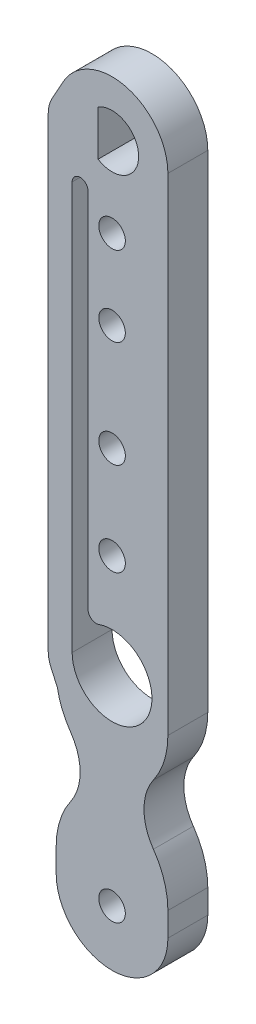
ISO-10303-21;
HEADER;
FILE_DESCRIPTION(('STEP AP214'),'2;1');
FILE_NAME('part.step','',(''),(''),'','','');
FILE_SCHEMA(('AUTOMOTIVE_DESIGN { 1 0 10303 214 1 1 1 1 }'));
ENDSEC;
DATA;
#1=APPLICATION_CONTEXT('core data for automotive mechanical design processes');
#2=APPLICATION_PROTOCOL_DEFINITION('international standard','automotive_design',2000,#1);
#3=PRODUCT_CONTEXT('',#1,'mechanical');
#4=PRODUCT('Part','Part','',(#3));
#5=PRODUCT_RELATED_PRODUCT_CATEGORY('part','',(#4));
#6=PRODUCT_DEFINITION_FORMATION('','',#4);
#7=PRODUCT_DEFINITION_CONTEXT('part definition',#1,'design');
#8=PRODUCT_DEFINITION('design','',#6,#7);
#9=PRODUCT_DEFINITION_SHAPE('','',#8);
#10=(LENGTH_UNIT() NAMED_UNIT(*) SI_UNIT(.MILLI.,.METRE.));
#11=(NAMED_UNIT(*) PLANE_ANGLE_UNIT() SI_UNIT($,.RADIAN.));
#12=(NAMED_UNIT(*) SI_UNIT($,.STERADIAN.) SOLID_ANGLE_UNIT());
#13=UNCERTAINTY_MEASURE_WITH_UNIT(LENGTH_MEASURE(1.E-05),#10,'distance_accuracy_value','');
#14=(GEOMETRIC_REPRESENTATION_CONTEXT(3) GLOBAL_UNCERTAINTY_ASSIGNED_CONTEXT((#13)) GLOBAL_UNIT_ASSIGNED_CONTEXT((#10,
#11,#12)) REPRESENTATION_CONTEXT('',''));
#15=CARTESIAN_POINT('',(0.,0.,0.));
#16=DIRECTION('',(0.,0.,1.));
#17=DIRECTION('',(1.,0.,0.));
#18=AXIS2_PLACEMENT_3D('',#15,#16,#17);
#19=CARTESIAN_POINT('',(-340.183039587022,54.0177257171476,3.));
#20=DIRECTION('',(0.,0.,1.));
#21=DIRECTION('',(1.,0.,0.));
#22=AXIS2_PLACEMENT_3D('',#19,#20,#21);
#23=PLANE('',#22);
#24=CARTESIAN_POINT('',(-338.383039587022,63.6177257171478,3.));
#25=DIRECTION('',(0.,0.,1.));
#26=DIRECTION('',(1.,0.,0.));
#27=AXIS2_PLACEMENT_3D('',#24,#25,#26);
#28=CIRCLE('',#27,1.);
#29=CARTESIAN_POINT('',(-337.383039587022,63.6177257171478,3.));
#30=VERTEX_POINT('',#29);
#31=EDGE_CURVE('E721',#30,#30,#28,.T.);
#32=ORIENTED_EDGE('',*,*,#31,.F.);
#33=EDGE_LOOP('',(#32));
#34=FACE_BOUND('',#33,.T.);
#35=CARTESIAN_POINT('',(-338.383039587022,78.6177257171478,3.));
#36=DIRECTION('',(0.,0.,1.));
#37=DIRECTION('',(1.,0.,0.));
#38=AXIS2_PLACEMENT_3D('',#35,#36,#37);
#39=CIRCLE('',#38,0.999999999999998);
#40=CARTESIAN_POINT('',(-337.383039587022,78.6177257171478,3.));
#41=VERTEX_POINT('',#40);
#42=EDGE_CURVE('E207',#41,#41,#39,.T.);
#43=ORIENTED_EDGE('',*,*,#42,.F.);
#44=EDGE_LOOP('',(#43));
#45=FACE_BOUND('',#44,.T.);
#46=CARTESIAN_POINT('',(-340.183039587022,54.0177257171476,3.));
#47=DIRECTION('',(0.,0.,1.));
#48=DIRECTION('',(1.,0.,0.));
#49=AXIS2_PLACEMENT_3D('',#46,#47,#48);
#50=CIRCLE('',#49,6.);
#51=CARTESIAN_POINT('',(-335.27120079609,50.5718818884324,3.));
#52=VERTEX_POINT('',#51);
#53=CARTESIAN_POINT('',(-334.183039587022,54.0177257171476,3.));
#54=VERTEX_POINT('',#53);
#55=EDGE_CURVE('E255',#52,#54,#50,.T.);
#56=ORIENTED_EDGE('',*,*,#55,.T.);
#57=DIRECTION('',(0.,1.,0.));
#58=VECTOR('',#57,1.);
#59=CARTESIAN_POINT('',(-334.183039587022,54.0177257171476,3.));
#60=LINE('',#59,#58);
#61=CARTESIAN_POINT('',(-334.183039587022,90.6177257171478,3.));
#62=VERTEX_POINT('',#61);
#63=EDGE_CURVE('E258',#54,#62,#60,.T.);
#64=ORIENTED_EDGE('',*,*,#63,.T.);
#65=CARTESIAN_POINT('',(-338.383039587022,90.6177257171478,3.));
#66=DIRECTION('',(0.,0.,1.));
#67=DIRECTION('',(1.,0.,0.));
#68=AXIS2_PLACEMENT_3D('',#65,#66,#67);
#69=CIRCLE('',#68,4.20000000000002);
#70=CARTESIAN_POINT('',(-342.088358547563,92.595252303734,3.));
#71=VERTEX_POINT('',#70);
#72=EDGE_CURVE('E261',#62,#71,#69,.T.);
#73=ORIENTED_EDGE('',*,*,#72,.T.);
#74=DIRECTION('',(-0.484308711135793,-0.874897178140373,0.));
#75=VECTOR('',#74,1.);
#76=CARTESIAN_POINT('',(-342.088358547563,92.595252303734,3.));
#77=LINE('',#76,#75);
#78=CARTESIAN_POINT('',(-342.882792814559,91.160117476647,3.));
#79=VERTEX_POINT('',#78);
#80=EDGE_CURVE('E263',#71,#79,#77,.T.);
#81=ORIENTED_EDGE('',*,*,#80,.T.);
#82=CARTESIAN_POINT('',(-340.783039587022,89.9977765699208,3.));
#83=DIRECTION('',(0.,0.,1.));
#84=DIRECTION('',(1.,0.,0.));
#85=AXIS2_PLACEMENT_3D('',#82,#83,#84);
#86=CIRCLE('',#85,2.40000000000001);
#87=CARTESIAN_POINT('',(-343.183039587022,89.9977765699209,3.));
#88=VERTEX_POINT('',#87);
#89=EDGE_CURVE('E265',#79,#88,#86,.T.);
#90=ORIENTED_EDGE('',*,*,#89,.T.);
#91=DIRECTION('',(0.,-1.,0.));
#92=VECTOR('',#91,1.);
#93=CARTESIAN_POINT('',(-343.183039587022,89.9977765699209,3.));
#94=LINE('',#93,#92);
#95=CARTESIAN_POINT('',(-343.183039587022,55.020224039338,3.));
#96=VERTEX_POINT('',#95);
#97=EDGE_CURVE('E267',#88,#96,#94,.T.);
#98=ORIENTED_EDGE('',*,*,#97,.T.);
#99=CARTESIAN_POINT('',(-340.783039587022,55.0202240393379,3.));
#100=DIRECTION('',(0.,0.,1.));
#101=DIRECTION('',(1.,0.,0.));
#102=AXIS2_PLACEMENT_3D('',#99,#100,#101);
#103=CIRCLE('',#102,2.40000000000006);
#104=CARTESIAN_POINT('',(-342.964857766499,54.0203893371468,3.));
#105=VERTEX_POINT('',#104);
#106=EDGE_CURVE('E269',#96,#105,#103,.T.);
#107=ORIENTED_EDGE('',*,*,#106,.T.);
#108=DIRECTION('',(0.416597792579682,-0.909090908115209,0.));
#109=VECTOR('',#108,1.);
#110=CARTESIAN_POINT('',(-342.964857766499,54.0203893371468,3.));
#111=LINE('',#110,#109);
#112=CARTESIAN_POINT('',(-342.495395341089,52.995938343303,3.));
#113=VERTEX_POINT('',#112);
#114=EDGE_CURVE('E271',#105,#113,#111,.T.);
#115=ORIENTED_EDGE('',*,*,#114,.T.);
#116=CARTESIAN_POINT('',(-336.583039587022,54.0177257171475,3.));
#117=DIRECTION('',(0.,0.,1.));
#118=DIRECTION('',(1.,0.,0.));
#119=AXIS2_PLACEMENT_3D('',#116,#117,#118);
#120=CIRCLE('',#119,5.99999999999999);
#121=CARTESIAN_POINT('',(-341.494878377954,50.5718818884324,3.));
#122=VERTEX_POINT('',#121);
#123=EDGE_CURVE('E273',#113,#122,#120,.T.);
#124=ORIENTED_EDGE('',*,*,#123,.T.);
#125=CARTESIAN_POINT('',(-344.708039587022,48.3177257171477,3.));
#126=DIRECTION('',(0.,0.,-1.));
#127=DIRECTION('',(1.,0.,0.));
#128=AXIS2_PLACEMENT_3D('',#125,#126,#127);
#129=CIRCLE('',#128,3.92499999999998);
#130=CARTESIAN_POINT('',(-341.494878377954,46.0635695458632,3.));
#131=VERTEX_POINT('',#130);
#132=EDGE_CURVE('E275',#122,#131,#129,.T.);
#133=ORIENTED_EDGE('',*,*,#132,.T.);
#134=CARTESIAN_POINT('',(-336.583039587022,42.6177257171478,3.));
#135=DIRECTION('',(0.,0.,1.));
#136=DIRECTION('',(1.,0.,0.));
#137=AXIS2_PLACEMENT_3D('',#134,#135,#136);
#138=CIRCLE('',#137,6.);
#139=CARTESIAN_POINT('',(-342.583039587022,42.6177257171478,3.));
#140=VERTEX_POINT('',#139);
#141=EDGE_CURVE('E277',#131,#140,#138,.T.);
#142=ORIENTED_EDGE('',*,*,#141,.T.);
#143=DIRECTION('',(0.,-1.,0.));
#144=VECTOR('',#143,1.);
#145=CARTESIAN_POINT('',(-342.583039587022,42.6177257171478,3.));
#146=LINE('',#145,#144);
#147=CARTESIAN_POINT('',(-342.583039587022,40.8177257171477,3.));
#148=VERTEX_POINT('',#147);
#149=EDGE_CURVE('E279',#140,#148,#146,.T.);
#150=ORIENTED_EDGE('',*,*,#149,.T.);
#151=CARTESIAN_POINT('',(-338.383039587022,40.8177257171477,3.));
#152=DIRECTION('',(0.,0.,1.));
#153=DIRECTION('',(1.,0.,0.));
#154=AXIS2_PLACEMENT_3D('',#151,#152,#153);
#155=CIRCLE('',#154,4.19999999999998);
#156=CARTESIAN_POINT('',(-334.183039587022,40.8177257171477,3.));
#157=VERTEX_POINT('',#156);
#158=EDGE_CURVE('E281',#148,#157,#155,.T.);
#159=ORIENTED_EDGE('',*,*,#158,.T.);
#160=DIRECTION('',(0.,1.,0.));
#161=VECTOR('',#160,1.);
#162=CARTESIAN_POINT('',(-334.183039587022,40.8177257171477,3.));
#163=LINE('',#162,#161);
#164=CARTESIAN_POINT('',(-334.183039587022,42.6177257171478,3.));
#165=VERTEX_POINT('',#164);
#166=EDGE_CURVE('E283',#157,#165,#163,.T.);
#167=ORIENTED_EDGE('',*,*,#166,.T.);
#168=CARTESIAN_POINT('',(-340.183039587022,42.6177257171478,3.));
#169=DIRECTION('',(0.,0.,1.));
#170=DIRECTION('',(1.,0.,0.));
#171=AXIS2_PLACEMENT_3D('',#168,#169,#170);
#172=CIRCLE('',#171,5.99999999999998);
#173=CARTESIAN_POINT('',(-335.27120079609,46.0635695458631,3.));
#174=VERTEX_POINT('',#173);
#175=EDGE_CURVE('E285',#165,#174,#172,.T.);
#176=ORIENTED_EDGE('',*,*,#175,.T.);
#177=CARTESIAN_POINT('',(-332.058039587022,48.3177257171477,3.));
#178=DIRECTION('',(0.,0.,-1.));
#179=DIRECTION('',(1.,0.,0.));
#180=AXIS2_PLACEMENT_3D('',#177,#178,#179);
#181=CIRCLE('',#180,3.92499999999998);
#182=EDGE_CURVE('E287',#174,#52,#181,.T.);
#183=ORIENTED_EDGE('',*,*,#182,.T.);
#184=EDGE_LOOP('',(#56,#64,#73,#81,#90,#98,#107,#115,#124,#133,#142,#150,#159,#167,#176,#183));
#185=FACE_BOUND('',#184,.T.);
#186=CARTESIAN_POINT('',(-338.383039587022,84.6177257171478,3.));
#187=DIRECTION('',(0.,0.,1.));
#188=DIRECTION('',(1.,0.,0.));
#189=AXIS2_PLACEMENT_3D('',#186,#187,#188);
#190=CIRCLE('',#189,0.999999999999998);
#191=CARTESIAN_POINT('',(-337.383039587022,84.6177257171478,3.));
#192=VERTEX_POINT('',#191);
#193=EDGE_CURVE('E249',#192,#192,#190,.T.);
#194=ORIENTED_EDGE('',*,*,#193,.F.);
#195=EDGE_LOOP('',(#194));
#196=FACE_BOUND('',#195,.T.);
#197=DIRECTION('',(0.,1.,0.));
#198=VECTOR('',#197,1.);
#199=CARTESIAN_POINT('',(-340.183039587022,59.2118382668432,3.));
#200=LINE('',#199,#198);
#201=CARTESIAN_POINT('',(-340.183039587022,59.2118382668432,3.));
#202=VERTEX_POINT('',#201);
#203=CARTESIAN_POINT('',(-340.183039587022,86.4608037789825,3.));
#204=VERTEX_POINT('',#203);
#205=EDGE_CURVE('E213',#202,#204,#200,.T.);
#206=ORIENTED_EDGE('',*,*,#205,.F.);
#207=CARTESIAN_POINT('',(-339.583039587022,59.2118382668432,3.));
#208=DIRECTION('',(0.,0.,-1.));
#209=DIRECTION('',(1.,0.,0.));
#210=AXIS2_PLACEMENT_3D('',#207,#208,#209);
#211=CIRCLE('',#210,0.600000000000008);
#212=CARTESIAN_POINT('',(-339.383039587022,58.6461528418939,3.));
#213=VERTEX_POINT('',#212);
#214=EDGE_CURVE('E211',#213,#202,#211,.T.);
#215=ORIENTED_EDGE('',*,*,#214,.F.);
#216=CARTESIAN_POINT('',(-338.383039587022,55.8177257171477,3.));
#217=DIRECTION('',(0.,0.,1.));
#218=DIRECTION('',(1.,0.,0.));
#219=AXIS2_PLACEMENT_3D('',#216,#217,#218);
#220=CIRCLE('',#219,3.);
#221=CARTESIAN_POINT('',(-341.383039587022,55.8177257171477,3.));
#222=VERTEX_POINT('',#221);
#223=EDGE_CURVE('E221',#222,#213,#220,.T.);
#224=ORIENTED_EDGE('',*,*,#223,.F.);
#225=DIRECTION('',(0.,-1.,0.));
#226=VECTOR('',#225,1.);
#227=CARTESIAN_POINT('',(-341.383039587022,86.4608037789825,3.));
#228=LINE('',#227,#226);
#229=CARTESIAN_POINT('',(-341.383039587022,86.4608037789825,3.));
#230=VERTEX_POINT('',#229);
#231=EDGE_CURVE('E218',#230,#222,#228,.T.);
#232=ORIENTED_EDGE('',*,*,#231,.F.);
#233=CARTESIAN_POINT('',(-340.783039587022,86.4608037789825,3.));
#234=DIRECTION('',(0.,0.,1.));
#235=DIRECTION('',(1.,0.,0.));
#236=AXIS2_PLACEMENT_3D('',#233,#234,#235);
#237=CIRCLE('',#236,0.600000000000017);
#238=EDGE_CURVE('E216',#204,#230,#237,.T.);
#239=ORIENTED_EDGE('',*,*,#238,.F.);
#240=EDGE_LOOP('',(#206,#215,#224,#232,#239));
#241=FACE_BOUND('',#240,.T.);
#242=DIRECTION('',(0.,-1.,0.));
#243=VECTOR('',#242,1.);
#244=CARTESIAN_POINT('',(-339.433039587022,90.6177257171478,3.));
#245=LINE('',#244,#243);
#246=CARTESIAN_POINT('',(-339.433039587022,92.3199301702026,3.));
#247=VERTEX_POINT('',#246);
#248=CARTESIAN_POINT('',(-339.433039587022,88.915521264093,3.));
#249=VERTEX_POINT('',#248);
#250=EDGE_CURVE('E189',#247,#249,#245,.T.);
#251=ORIENTED_EDGE('',*,*,#250,.F.);
#252=CARTESIAN_POINT('',(-338.383039587022,90.6177257171478,3.));
#253=DIRECTION('',(0.,0.,1.));
#254=DIRECTION('',(1.,0.,0.));
#255=AXIS2_PLACEMENT_3D('',#252,#253,#254);
#256=CIRCLE('',#255,1.99999999999998);
#257=EDGE_CURVE('E195',#249,#247,#256,.T.);
#258=ORIENTED_EDGE('',*,*,#257,.F.);
#259=EDGE_LOOP('',(#251,#258));
#260=FACE_BOUND('',#259,.T.);
#261=CARTESIAN_POINT('',(-338.383039587022,40.8177257171477,3.));
#262=DIRECTION('',(0.,0.,1.));
#263=DIRECTION('',(1.,0.,0.));
#264=AXIS2_PLACEMENT_3D('',#261,#262,#263);
#265=CIRCLE('',#264,0.999999999999998);
#266=CARTESIAN_POINT('',(-337.383039587022,40.8177257171477,3.));
#267=VERTEX_POINT('',#266);
#268=EDGE_CURVE('E727',#267,#267,#265,.T.);
#269=ORIENTED_EDGE('',*,*,#268,.F.);
#270=EDGE_LOOP('',(#269));
#271=FACE_BOUND('',#270,.T.);
#272=CARTESIAN_POINT('',(-338.383039587022,70.6177257171478,3.));
#273=DIRECTION('',(0.,0.,1.));
#274=DIRECTION('',(1.,0.,0.));
#275=AXIS2_PLACEMENT_3D('',#272,#273,#274);
#276=CIRCLE('',#275,1.);
#277=CARTESIAN_POINT('',(-337.383039587022,70.6177257171478,3.));
#278=VERTEX_POINT('',#277);
#279=EDGE_CURVE('E712',#278,#278,#276,.T.);
#280=ORIENTED_EDGE('',*,*,#279,.F.);
#281=EDGE_LOOP('',(#280));
#282=FACE_BOUND('',#281,.T.);
#283=ADVANCED_FACE('F35',(#34,#45,#185,#196,#241,#260,#271,#282),#23,.T.);
#284=CARTESIAN_POINT('',(-340.183039587022,54.0177257171476,0.));
#285=DIRECTION('',(0.,0.,1.));
#286=DIRECTION('',(1.,0.,0.));
#287=AXIS2_PLACEMENT_3D('',#284,#285,#286);
#288=PLANE('',#287);
#289=CARTESIAN_POINT('',(-339.583039587022,59.2118382668432,0.));
#290=DIRECTION('',(0.,0.,-1.));
#291=DIRECTION('',(1.,0.,0.));
#292=AXIS2_PLACEMENT_3D('',#289,#290,#291);
#293=CIRCLE('',#292,0.600000000000008);
#294=CARTESIAN_POINT('',(-339.383039587022,58.6461528418939,0.));
#295=VERTEX_POINT('',#294);
#296=CARTESIAN_POINT('',(-340.183039587022,59.2118382668432,0.));
#297=VERTEX_POINT('',#296);
#298=EDGE_CURVE('E210',#295,#297,#293,.T.);
#299=ORIENTED_EDGE('',*,*,#298,.T.);
#300=DIRECTION('',(0.,1.,0.));
#301=VECTOR('',#300,1.);
#302=CARTESIAN_POINT('',(-340.183039587022,59.2118382668432,0.));
#303=LINE('',#302,#301);
#304=CARTESIAN_POINT('',(-340.183039587022,86.4608037789825,0.));
#305=VERTEX_POINT('',#304);
#306=EDGE_CURVE('E226',#297,#305,#303,.T.);
#307=ORIENTED_EDGE('',*,*,#306,.T.);
#308=CARTESIAN_POINT('',(-340.783039587022,86.4608037789825,0.));
#309=DIRECTION('',(0.,0.,1.));
#310=DIRECTION('',(1.,0.,0.));
#311=AXIS2_PLACEMENT_3D('',#308,#309,#310);
#312=CIRCLE('',#311,0.600000000000017);
#313=CARTESIAN_POINT('',(-341.383039587022,86.4608037789825,0.));
#314=VERTEX_POINT('',#313);
#315=EDGE_CURVE('E229',#305,#314,#312,.T.);
#316=ORIENTED_EDGE('',*,*,#315,.T.);
#317=DIRECTION('',(0.,-1.,0.));
#318=VECTOR('',#317,1.);
#319=CARTESIAN_POINT('',(-341.383039587022,86.4608037789825,0.));
#320=LINE('',#319,#318);
#321=CARTESIAN_POINT('',(-341.383039587022,55.8177257171477,0.));
#322=VERTEX_POINT('',#321);
#323=EDGE_CURVE('E232',#314,#322,#320,.T.);
#324=ORIENTED_EDGE('',*,*,#323,.T.);
#325=CARTESIAN_POINT('',(-338.383039587022,55.8177257171477,0.));
#326=DIRECTION('',(0.,0.,1.));
#327=DIRECTION('',(1.,0.,0.));
#328=AXIS2_PLACEMENT_3D('',#325,#326,#327);
#329=CIRCLE('',#328,3.);
#330=EDGE_CURVE('E214',#322,#295,#329,.T.);
#331=ORIENTED_EDGE('',*,*,#330,.T.);
#332=EDGE_LOOP('',(#299,#307,#316,#324,#331));
#333=FACE_BOUND('',#332,.T.);
#334=CARTESIAN_POINT('',(-340.183039587022,54.0177257171476,0.));
#335=DIRECTION('',(0.,0.,1.));
#336=DIRECTION('',(1.,0.,0.));
#337=AXIS2_PLACEMENT_3D('',#334,#335,#336);
#338=CIRCLE('',#337,6.);
#339=CARTESIAN_POINT('',(-335.27120079609,50.5718818884324,0.));
#340=VERTEX_POINT('',#339);
#341=CARTESIAN_POINT('',(-334.183039587022,54.0177257171476,0.));
#342=VERTEX_POINT('',#341);
#343=EDGE_CURVE('E252',#340,#342,#338,.T.);
#344=ORIENTED_EDGE('',*,*,#343,.F.);
#345=CARTESIAN_POINT('',(-332.058039587022,48.3177257171477,0.));
#346=DIRECTION('',(0.,0.,-1.));
#347=DIRECTION('',(1.,0.,0.));
#348=AXIS2_PLACEMENT_3D('',#345,#346,#347);
#349=CIRCLE('',#348,3.92499999999998);
#350=CARTESIAN_POINT('',(-335.27120079609,46.0635695458631,0.));
#351=VERTEX_POINT('',#350);
#352=EDGE_CURVE('E259',#351,#340,#349,.T.);
#353=ORIENTED_EDGE('',*,*,#352,.F.);
#354=CARTESIAN_POINT('',(-340.183039587022,42.6177257171478,0.));
#355=DIRECTION('',(0.,0.,1.));
#356=DIRECTION('',(1.,0.,0.));
#357=AXIS2_PLACEMENT_3D('',#354,#355,#356);
#358=CIRCLE('',#357,5.99999999999998);
#359=CARTESIAN_POINT('',(-334.183039587022,42.6177257171478,0.));
#360=VERTEX_POINT('',#359);
#361=EDGE_CURVE('E318',#360,#351,#358,.T.);
#362=ORIENTED_EDGE('',*,*,#361,.F.);
#363=DIRECTION('',(0.,1.,0.));
#364=VECTOR('',#363,1.);
#365=CARTESIAN_POINT('',(-334.183039587022,40.8177257171477,0.));
#366=LINE('',#365,#364);
#367=CARTESIAN_POINT('',(-334.183039587022,40.8177257171477,0.));
#368=VERTEX_POINT('',#367);
#369=EDGE_CURVE('E316',#368,#360,#366,.T.);
#370=ORIENTED_EDGE('',*,*,#369,.F.);
#371=CARTESIAN_POINT('',(-338.383039587022,40.8177257171477,0.));
#372=DIRECTION('',(0.,0.,1.));
#373=DIRECTION('',(1.,0.,0.));
#374=AXIS2_PLACEMENT_3D('',#371,#372,#373);
#375=CIRCLE('',#374,4.19999999999998);
#376=CARTESIAN_POINT('',(-342.583039587022,40.8177257171477,0.));
#377=VERTEX_POINT('',#376);
#378=EDGE_CURVE('E314',#377,#368,#375,.T.);
#379=ORIENTED_EDGE('',*,*,#378,.F.);
#380=DIRECTION('',(0.,-1.,0.));
#381=VECTOR('',#380,1.);
#382=CARTESIAN_POINT('',(-342.583039587022,42.6177257171478,0.));
#383=LINE('',#382,#381);
#384=CARTESIAN_POINT('',(-342.583039587022,42.6177257171478,0.));
#385=VERTEX_POINT('',#384);
#386=EDGE_CURVE('E312',#385,#377,#383,.T.);
#387=ORIENTED_EDGE('',*,*,#386,.F.);
#388=CARTESIAN_POINT('',(-336.583039587022,42.6177257171478,0.));
#389=DIRECTION('',(0.,0.,1.));
#390=DIRECTION('',(1.,0.,0.));
#391=AXIS2_PLACEMENT_3D('',#388,#389,#390);
#392=CIRCLE('',#391,6.);
#393=CARTESIAN_POINT('',(-341.494878377954,46.0635695458632,0.));
#394=VERTEX_POINT('',#393);
#395=EDGE_CURVE('E310',#394,#385,#392,.T.);
#396=ORIENTED_EDGE('',*,*,#395,.F.);
#397=CARTESIAN_POINT('',(-344.708039587022,48.3177257171477,0.));
#398=DIRECTION('',(0.,0.,-1.));
#399=DIRECTION('',(1.,0.,0.));
#400=AXIS2_PLACEMENT_3D('',#397,#398,#399);
#401=CIRCLE('',#400,3.92499999999998);
#402=CARTESIAN_POINT('',(-341.494878377954,50.5718818884324,0.));
#403=VERTEX_POINT('',#402);
#404=EDGE_CURVE('E308',#403,#394,#401,.T.);
#405=ORIENTED_EDGE('',*,*,#404,.F.);
#406=CARTESIAN_POINT('',(-336.583039587022,54.0177257171475,0.));
#407=DIRECTION('',(0.,0.,1.));
#408=DIRECTION('',(1.,0.,0.));
#409=AXIS2_PLACEMENT_3D('',#406,#407,#408);
#410=CIRCLE('',#409,5.99999999999999);
#411=CARTESIAN_POINT('',(-342.495395341089,52.995938343303,0.));
#412=VERTEX_POINT('',#411);
#413=EDGE_CURVE('E306',#412,#403,#410,.T.);
#414=ORIENTED_EDGE('',*,*,#413,.F.);
#415=DIRECTION('',(0.416597792579682,-0.909090908115209,0.));
#416=VECTOR('',#415,1.);
#417=CARTESIAN_POINT('',(-342.964857766499,54.0203893371468,0.));
#418=LINE('',#417,#416);
#419=CARTESIAN_POINT('',(-342.964857766499,54.0203893371468,0.));
#420=VERTEX_POINT('',#419);
#421=EDGE_CURVE('E304',#420,#412,#418,.T.);
#422=ORIENTED_EDGE('',*,*,#421,.F.);
#423=CARTESIAN_POINT('',(-340.783039587022,55.0202240393379,0.));
#424=DIRECTION('',(0.,0.,1.));
#425=DIRECTION('',(1.,0.,0.));
#426=AXIS2_PLACEMENT_3D('',#423,#424,#425);
#427=CIRCLE('',#426,2.40000000000006);
#428=CARTESIAN_POINT('',(-343.183039587022,55.020224039338,0.));
#429=VERTEX_POINT('',#428);
#430=EDGE_CURVE('E302',#429,#420,#427,.T.);
#431=ORIENTED_EDGE('',*,*,#430,.F.);
#432=DIRECTION('',(0.,-1.,0.));
#433=VECTOR('',#432,1.);
#434=CARTESIAN_POINT('',(-343.183039587022,89.9977765699209,0.));
#435=LINE('',#434,#433);
#436=CARTESIAN_POINT('',(-343.183039587022,89.9977765699209,0.));
#437=VERTEX_POINT('',#436);
#438=EDGE_CURVE('E300',#437,#429,#435,.T.);
#439=ORIENTED_EDGE('',*,*,#438,.F.);
#440=CARTESIAN_POINT('',(-340.783039587022,89.9977765699208,0.));
#441=DIRECTION('',(0.,0.,1.));
#442=DIRECTION('',(1.,0.,0.));
#443=AXIS2_PLACEMENT_3D('',#440,#441,#442);
#444=CIRCLE('',#443,2.40000000000001);
#445=CARTESIAN_POINT('',(-342.882792814559,91.160117476647,0.));
#446=VERTEX_POINT('',#445);
#447=EDGE_CURVE('E298',#446,#437,#444,.T.);
#448=ORIENTED_EDGE('',*,*,#447,.F.);
#449=DIRECTION('',(-0.484308711135793,-0.874897178140373,0.));
#450=VECTOR('',#449,1.);
#451=CARTESIAN_POINT('',(-342.088358547563,92.595252303734,0.));
#452=LINE('',#451,#450);
#453=CARTESIAN_POINT('',(-342.088358547563,92.595252303734,0.));
#454=VERTEX_POINT('',#453);
#455=EDGE_CURVE('E296',#454,#446,#452,.T.);
#456=ORIENTED_EDGE('',*,*,#455,.F.);
#457=CARTESIAN_POINT('',(-338.383039587022,90.6177257171478,0.));
#458=DIRECTION('',(0.,0.,1.));
#459=DIRECTION('',(1.,0.,0.));
#460=AXIS2_PLACEMENT_3D('',#457,#458,#459);
#461=CIRCLE('',#460,4.20000000000002);
#462=CARTESIAN_POINT('',(-334.183039587022,90.6177257171478,0.));
#463=VERTEX_POINT('',#462);
#464=EDGE_CURVE('E294',#463,#454,#461,.T.);
#465=ORIENTED_EDGE('',*,*,#464,.F.);
#466=DIRECTION('',(0.,1.,0.));
#467=VECTOR('',#466,1.);
#468=CARTESIAN_POINT('',(-334.183039587022,54.0177257171476,0.));
#469=LINE('',#468,#467);
#470=EDGE_CURVE('E292',#342,#463,#469,.T.);
#471=ORIENTED_EDGE('',*,*,#470,.F.);
#472=EDGE_LOOP('',(#344,#353,#362,#370,#379,#387,#396,#405,#414,#422,#431,#439,#448,#456,#465,#471));
#473=FACE_BOUND('',#472,.T.);
#474=CARTESIAN_POINT('',(-338.383039587022,84.6177257171478,0.));
#475=DIRECTION('',(0.,0.,1.));
#476=DIRECTION('',(1.,0.,0.));
#477=AXIS2_PLACEMENT_3D('',#474,#475,#476);
#478=CIRCLE('',#477,0.999999999999998);
#479=CARTESIAN_POINT('',(-337.383039587022,84.6177257171478,0.));
#480=VERTEX_POINT('',#479);
#481=EDGE_CURVE('E248',#480,#480,#478,.T.);
#482=ORIENTED_EDGE('',*,*,#481,.T.);
#483=EDGE_LOOP('',(#482));
#484=FACE_BOUND('',#483,.T.);
#485=CARTESIAN_POINT('',(-338.383039587022,90.6177257171478,0.));
#486=DIRECTION('',(0.,0.,1.));
#487=DIRECTION('',(1.,0.,0.));
#488=AXIS2_PLACEMENT_3D('',#485,#486,#487);
#489=CIRCLE('',#488,1.99999999999998);
#490=CARTESIAN_POINT('',(-339.433039587022,88.915521264093,0.));
#491=VERTEX_POINT('',#490);
#492=CARTESIAN_POINT('',(-339.433039587022,92.3199301702026,0.));
#493=VERTEX_POINT('',#492);
#494=EDGE_CURVE('E57',#491,#493,#489,.T.);
#495=ORIENTED_EDGE('',*,*,#494,.T.);
#496=DIRECTION('',(0.,-1.,0.));
#497=VECTOR('',#496,1.);
#498=CARTESIAN_POINT('',(-339.433039587022,90.6177257171478,0.));
#499=LINE('',#498,#497);
#500=EDGE_CURVE('E200',#493,#491,#499,.T.);
#501=ORIENTED_EDGE('',*,*,#500,.T.);
#502=EDGE_LOOP('',(#495,#501));
#503=FACE_BOUND('',#502,.T.);
#504=CARTESIAN_POINT('',(-338.383039587022,78.6177257171478,0.));
#505=DIRECTION('',(0.,0.,1.));
#506=DIRECTION('',(1.,0.,0.));
#507=AXIS2_PLACEMENT_3D('',#504,#505,#506);
#508=CIRCLE('',#507,0.999999999999998);
#509=CARTESIAN_POINT('',(-337.383039587022,78.6177257171478,0.));
#510=VERTEX_POINT('',#509);
#511=EDGE_CURVE('E204',#510,#510,#508,.T.);
#512=ORIENTED_EDGE('',*,*,#511,.T.);
#513=EDGE_LOOP('',(#512));
#514=FACE_BOUND('',#513,.T.);
#515=CARTESIAN_POINT('',(-338.383039587022,40.8177257171477,0.));
#516=DIRECTION('',(0.,0.,1.));
#517=DIRECTION('',(1.,0.,0.));
#518=AXIS2_PLACEMENT_3D('',#515,#516,#517);
#519=CIRCLE('',#518,0.999999999999998);
#520=CARTESIAN_POINT('',(-337.383039587022,40.8177257171477,0.));
#521=VERTEX_POINT('',#520);
#522=EDGE_CURVE('E724',#521,#521,#519,.T.);
#523=ORIENTED_EDGE('',*,*,#522,.T.);
#524=EDGE_LOOP('',(#523));
#525=FACE_BOUND('',#524,.T.);
#526=CARTESIAN_POINT('',(-338.383039587022,63.6177257171478,0.));
#527=DIRECTION('',(0.,0.,1.));
#528=DIRECTION('',(1.,0.,0.));
#529=AXIS2_PLACEMENT_3D('',#526,#527,#528);
#530=CIRCLE('',#529,1.);
#531=CARTESIAN_POINT('',(-337.383039587022,63.6177257171478,0.));
#532=VERTEX_POINT('',#531);
#533=EDGE_CURVE('E718',#532,#532,#530,.T.);
#534=ORIENTED_EDGE('',*,*,#533,.T.);
#535=EDGE_LOOP('',(#534));
#536=FACE_BOUND('',#535,.T.);
#537=CARTESIAN_POINT('',(-338.383039587022,70.6177257171478,0.));
#538=DIRECTION('',(0.,0.,1.));
#539=DIRECTION('',(1.,0.,0.));
#540=AXIS2_PLACEMENT_3D('',#537,#538,#539);
#541=CIRCLE('',#540,1.);
#542=CARTESIAN_POINT('',(-337.383039587022,70.6177257171478,0.));
#543=VERTEX_POINT('',#542);
#544=EDGE_CURVE('E715',#543,#543,#541,.T.);
#545=ORIENTED_EDGE('',*,*,#544,.T.);
#546=EDGE_LOOP('',(#545));
#547=FACE_BOUND('',#546,.T.);
#548=ADVANCED_FACE('F372',(#333,#473,#484,#503,#514,#525,#536,#547),#288,.F.);
#549=CARTESIAN_POINT('',(-340.183039587022,54.0177257171476,3.));
#550=DIRECTION('',(0.,0.,-1.));
#551=DIRECTION('',(-1.,0.,0.));
#552=AXIS2_PLACEMENT_3D('',#549,#550,#551);
#553=CYLINDRICAL_SURFACE('',#552,6.);
#554=ORIENTED_EDGE('',*,*,#343,.T.);
#555=DIRECTION('',(0.,0.,-1.));
#556=VECTOR('',#555,1.);
#557=CARTESIAN_POINT('',(-334.183039587022,54.0177257171476,3.));
#558=LINE('',#557,#556);
#559=EDGE_CURVE('E11',#54,#342,#558,.T.);
#560=ORIENTED_EDGE('',*,*,#559,.F.);
#561=ORIENTED_EDGE('',*,*,#55,.F.);
#562=DIRECTION('',(0.,0.,-1.));
#563=VECTOR('',#562,1.);
#564=CARTESIAN_POINT('',(-335.27120079609,50.5718818884324,3.));
#565=LINE('',#564,#563);
#566=EDGE_CURVE('E289',#52,#340,#565,.T.);
#567=ORIENTED_EDGE('',*,*,#566,.T.);
#568=EDGE_LOOP('',(#554,#560,#561,#567));
#569=FACE_BOUND('',#568,.T.);
#570=ADVANCED_FACE('F37',(#569),#553,.T.);
#571=CARTESIAN_POINT('',(-334.183039587022,54.0177257171476,3.));
#572=DIRECTION('',(-1.,0.,0.));
#573=DIRECTION('',(0.,0.,1.));
#574=AXIS2_PLACEMENT_3D('',#571,#572,#573);
#575=PLANE('',#574);
#576=ORIENTED_EDGE('',*,*,#470,.T.);
#577=DIRECTION('',(0.,0.,-1.));
#578=VECTOR('',#577,1.);
#579=CARTESIAN_POINT('',(-334.183039587022,90.6177257171478,3.));
#580=LINE('',#579,#578);
#581=EDGE_CURVE('E43',#62,#463,#580,.T.);
#582=ORIENTED_EDGE('',*,*,#581,.F.);
#583=ORIENTED_EDGE('',*,*,#63,.F.);
#584=ORIENTED_EDGE('',*,*,#559,.T.);
#585=EDGE_LOOP('',(#576,#582,#583,#584));
#586=FACE_BOUND('',#585,.T.);
#587=ADVANCED_FACE('F390',(#586),#575,.F.);
#588=CARTESIAN_POINT('',(-338.383039587022,90.6177257171478,3.));
#589=DIRECTION('',(0.,0.,-1.));
#590=DIRECTION('',(-1.,0.,0.));
#591=AXIS2_PLACEMENT_3D('',#588,#589,#590);
#592=CYLINDRICAL_SURFACE('',#591,4.20000000000002);
#593=ORIENTED_EDGE('',*,*,#464,.T.);
#594=DIRECTION('',(0.,0.,-1.));
#595=VECTOR('',#594,1.);
#596=CARTESIAN_POINT('',(-342.088358547563,92.595252303734,3.));
#597=LINE('',#596,#595);
#598=EDGE_CURVE('E359',#71,#454,#597,.T.);
#599=ORIENTED_EDGE('',*,*,#598,.F.);
#600=ORIENTED_EDGE('',*,*,#72,.F.);
#601=ORIENTED_EDGE('',*,*,#581,.T.);
#602=EDGE_LOOP('',(#593,#599,#600,#601));
#603=FACE_BOUND('',#602,.T.);
#604=ADVANCED_FACE('F366',(#603),#592,.T.);
#605=CARTESIAN_POINT('',(-342.088358547563,92.595252303734,3.));
#606=DIRECTION('',(0.874897178140373,-0.484308711135793,0.));
#607=DIRECTION('',(0.484308711135793,0.874897178140373,0.));
#608=AXIS2_PLACEMENT_3D('',#605,#606,#607);
#609=PLANE('',#608);
#610=ORIENTED_EDGE('',*,*,#455,.T.);
#611=DIRECTION('',(0.,0.,-1.));
#612=VECTOR('',#611,1.);
#613=CARTESIAN_POINT('',(-342.882792814559,91.160117476647,3.));
#614=LINE('',#613,#612);
#615=EDGE_CURVE('E356',#79,#446,#614,.T.);
#616=ORIENTED_EDGE('',*,*,#615,.F.);
#617=ORIENTED_EDGE('',*,*,#80,.F.);
#618=ORIENTED_EDGE('',*,*,#598,.T.);
#619=EDGE_LOOP('',(#610,#616,#617,#618));
#620=FACE_BOUND('',#619,.T.);
#621=ADVANCED_FACE('F378',(#620),#609,.F.);
#622=CARTESIAN_POINT('',(-340.783039587022,89.9977765699208,3.));
#623=DIRECTION('',(0.,0.,-1.));
#624=DIRECTION('',(-1.,0.,0.));
#625=AXIS2_PLACEMENT_3D('',#622,#623,#624);
#626=CYLINDRICAL_SURFACE('',#625,2.40000000000001);
#627=ORIENTED_EDGE('',*,*,#447,.T.);
#628=DIRECTION('',(0.,0.,-1.));
#629=VECTOR('',#628,1.);
#630=CARTESIAN_POINT('',(-343.183039587022,89.9977765699209,3.));
#631=LINE('',#630,#629);
#632=EDGE_CURVE('E353',#88,#437,#631,.T.);
#633=ORIENTED_EDGE('',*,*,#632,.F.);
#634=ORIENTED_EDGE('',*,*,#89,.F.);
#635=ORIENTED_EDGE('',*,*,#615,.T.);
#636=EDGE_LOOP('',(#627,#633,#634,#635));
#637=FACE_BOUND('',#636,.T.);
#638=ADVANCED_FACE('F382',(#637),#626,.T.);
#639=CARTESIAN_POINT('',(-343.183039587022,89.9977765699209,3.));
#640=DIRECTION('',(1.,0.,0.));
#641=DIRECTION('',(0.,1.,0.));
#642=AXIS2_PLACEMENT_3D('',#639,#640,#641);
#643=PLANE('',#642);
#644=ORIENTED_EDGE('',*,*,#438,.T.);
#645=DIRECTION('',(0.,0.,-1.));
#646=VECTOR('',#645,1.);
#647=CARTESIAN_POINT('',(-343.183039587022,55.020224039338,3.));
#648=LINE('',#647,#646);
#649=EDGE_CURVE('E350',#96,#429,#648,.T.);
#650=ORIENTED_EDGE('',*,*,#649,.F.);
#651=ORIENTED_EDGE('',*,*,#97,.F.);
#652=ORIENTED_EDGE('',*,*,#632,.T.);
#653=EDGE_LOOP('',(#644,#650,#651,#652));
#654=FACE_BOUND('',#653,.T.);
#655=ADVANCED_FACE('F443',(#654),#643,.F.);
#656=CARTESIAN_POINT('',(-340.783039587022,55.0202240393379,3.));
#657=DIRECTION('',(0.,0.,-1.));
#658=DIRECTION('',(-1.,0.,0.));
#659=AXIS2_PLACEMENT_3D('',#656,#657,#658);
#660=CYLINDRICAL_SURFACE('',#659,2.40000000000006);
#661=ORIENTED_EDGE('',*,*,#430,.T.);
#662=DIRECTION('',(0.,0.,-1.));
#663=VECTOR('',#662,1.);
#664=CARTESIAN_POINT('',(-342.964857766499,54.0203893371468,3.));
#665=LINE('',#664,#663);
#666=EDGE_CURVE('E347',#105,#420,#665,.T.);
#667=ORIENTED_EDGE('',*,*,#666,.F.);
#668=ORIENTED_EDGE('',*,*,#106,.F.);
#669=ORIENTED_EDGE('',*,*,#649,.T.);
#670=EDGE_LOOP('',(#661,#667,#668,#669));
#671=FACE_BOUND('',#670,.T.);
#672=ADVANCED_FACE('F440',(#671),#660,.T.);
#673=CARTESIAN_POINT('',(-342.964857766499,54.0203893371468,3.));
#674=DIRECTION('',(0.909090908115209,0.416597792579683,0.));
#675=DIRECTION('',(-0.416597792579683,0.909090908115209,0.));
#676=AXIS2_PLACEMENT_3D('',#673,#674,#675);
#677=PLANE('',#676);
#678=ORIENTED_EDGE('',*,*,#421,.T.);
#679=DIRECTION('',(0.,0.,-1.));
#680=VECTOR('',#679,1.);
#681=CARTESIAN_POINT('',(-342.495395341089,52.995938343303,3.));
#682=LINE('',#681,#680);
#683=EDGE_CURVE('E344',#113,#412,#682,.T.);
#684=ORIENTED_EDGE('',*,*,#683,.F.);
#685=ORIENTED_EDGE('',*,*,#114,.F.);
#686=ORIENTED_EDGE('',*,*,#666,.T.);
#687=EDGE_LOOP('',(#678,#684,#685,#686));
#688=FACE_BOUND('',#687,.T.);
#689=ADVANCED_FACE('F436',(#688),#677,.F.);
#690=CARTESIAN_POINT('',(-336.583039587022,54.0177257171475,3.));
#691=DIRECTION('',(0.,0.,-1.));
#692=DIRECTION('',(-1.,0.,0.));
#693=AXIS2_PLACEMENT_3D('',#690,#691,#692);
#694=CYLINDRICAL_SURFACE('',#693,5.99999999999999);
#695=ORIENTED_EDGE('',*,*,#413,.T.);
#696=DIRECTION('',(0.,0.,-1.));
#697=VECTOR('',#696,1.);
#698=CARTESIAN_POINT('',(-341.494878377954,50.5718818884324,3.));
#699=LINE('',#698,#697);
#700=EDGE_CURVE('E341',#122,#403,#699,.T.);
#701=ORIENTED_EDGE('',*,*,#700,.F.);
#702=ORIENTED_EDGE('',*,*,#123,.F.);
#703=ORIENTED_EDGE('',*,*,#683,.T.);
#704=EDGE_LOOP('',(#695,#701,#702,#703));
#705=FACE_BOUND('',#704,.T.);
#706=ADVANCED_FACE('F432',(#705),#694,.T.);
#707=CARTESIAN_POINT('',(-344.708039587022,48.3177257171477,3.));
#708=DIRECTION('',(0.,0.,-1.));
#709=DIRECTION('',(-1.,0.,0.));
#710=AXIS2_PLACEMENT_3D('',#707,#708,#709);
#711=CYLINDRICAL_SURFACE('',#710,3.92499999999998);
#712=ORIENTED_EDGE('',*,*,#404,.T.);
#713=DIRECTION('',(0.,0.,-1.));
#714=VECTOR('',#713,1.);
#715=CARTESIAN_POINT('',(-341.494878377954,46.0635695458632,3.));
#716=LINE('',#715,#714);
#717=EDGE_CURVE('E338',#131,#394,#716,.T.);
#718=ORIENTED_EDGE('',*,*,#717,.F.);
#719=ORIENTED_EDGE('',*,*,#132,.F.);
#720=ORIENTED_EDGE('',*,*,#700,.T.);
#721=EDGE_LOOP('',(#712,#718,#719,#720));
#722=FACE_BOUND('',#721,.T.);
#723=ADVANCED_FACE('F427',(#722),#711,.F.);
#724=CARTESIAN_POINT('',(-336.583039587022,42.6177257171478,3.));
#725=DIRECTION('',(0.,0.,-1.));
#726=DIRECTION('',(-1.,0.,0.));
#727=AXIS2_PLACEMENT_3D('',#724,#725,#726);
#728=CYLINDRICAL_SURFACE('',#727,6.);
#729=ORIENTED_EDGE('',*,*,#395,.T.);
#730=DIRECTION('',(0.,0.,-1.));
#731=VECTOR('',#730,1.);
#732=CARTESIAN_POINT('',(-342.583039587022,42.6177257171478,3.));
#733=LINE('',#732,#731);
#734=EDGE_CURVE('E335',#140,#385,#733,.T.);
#735=ORIENTED_EDGE('',*,*,#734,.F.);
#736=ORIENTED_EDGE('',*,*,#141,.F.);
#737=ORIENTED_EDGE('',*,*,#717,.T.);
#738=EDGE_LOOP('',(#729,#735,#736,#737));
#739=FACE_BOUND('',#738,.T.);
#740=ADVANCED_FACE('F421',(#739),#728,.T.);
#741=CARTESIAN_POINT('',(-342.583039587022,42.6177257171478,3.));
#742=DIRECTION('',(1.,0.,0.));
#743=DIRECTION('',(0.,1.,0.));
#744=AXIS2_PLACEMENT_3D('',#741,#742,#743);
#745=PLANE('',#744);
#746=ORIENTED_EDGE('',*,*,#386,.T.);
#747=DIRECTION('',(0.,0.,-1.));
#748=VECTOR('',#747,1.);
#749=CARTESIAN_POINT('',(-342.583039587022,40.8177257171477,3.));
#750=LINE('',#749,#748);
#751=EDGE_CURVE('E332',#148,#377,#750,.T.);
#752=ORIENTED_EDGE('',*,*,#751,.F.);
#753=ORIENTED_EDGE('',*,*,#149,.F.);
#754=ORIENTED_EDGE('',*,*,#734,.T.);
#755=EDGE_LOOP('',(#746,#752,#753,#754));
#756=FACE_BOUND('',#755,.T.);
#757=ADVANCED_FACE('F417',(#756),#745,.F.);
#758=CARTESIAN_POINT('',(-338.383039587022,40.8177257171477,3.));
#759=DIRECTION('',(0.,0.,-1.));
#760=DIRECTION('',(-1.,0.,0.));
#761=AXIS2_PLACEMENT_3D('',#758,#759,#760);
#762=CYLINDRICAL_SURFACE('',#761,4.19999999999998);
#763=ORIENTED_EDGE('',*,*,#378,.T.);
#764=DIRECTION('',(0.,0.,-1.));
#765=VECTOR('',#764,1.);
#766=CARTESIAN_POINT('',(-334.183039587022,40.8177257171477,3.));
#767=LINE('',#766,#765);
#768=EDGE_CURVE('E329',#157,#368,#767,.T.);
#769=ORIENTED_EDGE('',*,*,#768,.F.);
#770=ORIENTED_EDGE('',*,*,#158,.F.);
#771=ORIENTED_EDGE('',*,*,#751,.T.);
#772=EDGE_LOOP('',(#763,#769,#770,#771));
#773=FACE_BOUND('',#772,.T.);
#774=ADVANCED_FACE('F412',(#773),#762,.T.);
#775=CARTESIAN_POINT('',(-334.183039587022,40.8177257171477,3.));
#776=DIRECTION('',(-1.,0.,0.));
#777=DIRECTION('',(0.,-1.,0.));
#778=AXIS2_PLACEMENT_3D('',#775,#776,#777);
#779=PLANE('',#778);
#780=ORIENTED_EDGE('',*,*,#369,.T.);
#781=DIRECTION('',(0.,0.,-1.));
#782=VECTOR('',#781,1.);
#783=CARTESIAN_POINT('',(-334.183039587022,42.6177257171478,3.));
#784=LINE('',#783,#782);
#785=EDGE_CURVE('E326',#165,#360,#784,.T.);
#786=ORIENTED_EDGE('',*,*,#785,.F.);
#787=ORIENTED_EDGE('',*,*,#166,.F.);
#788=ORIENTED_EDGE('',*,*,#768,.T.);
#789=EDGE_LOOP('',(#780,#786,#787,#788));
#790=FACE_BOUND('',#789,.T.);
#791=ADVANCED_FACE('F406',(#790),#779,.F.);
#792=CARTESIAN_POINT('',(-340.183039587022,42.6177257171478,3.));
#793=DIRECTION('',(0.,0.,-1.));
#794=DIRECTION('',(-1.,0.,0.));
#795=AXIS2_PLACEMENT_3D('',#792,#793,#794);
#796=CYLINDRICAL_SURFACE('',#795,5.99999999999998);
#797=ORIENTED_EDGE('',*,*,#361,.T.);
#798=DIRECTION('',(0.,0.,-1.));
#799=VECTOR('',#798,1.);
#800=CARTESIAN_POINT('',(-335.27120079609,46.0635695458631,3.));
#801=LINE('',#800,#799);
#802=EDGE_CURVE('E323',#174,#351,#801,.T.);
#803=ORIENTED_EDGE('',*,*,#802,.F.);
#804=ORIENTED_EDGE('',*,*,#175,.F.);
#805=ORIENTED_EDGE('',*,*,#785,.T.);
#806=EDGE_LOOP('',(#797,#803,#804,#805));
#807=FACE_BOUND('',#806,.T.);
#808=ADVANCED_FACE('F402',(#807),#796,.T.);
#809=CARTESIAN_POINT('',(-332.058039587022,48.3177257171477,3.));
#810=DIRECTION('',(0.,0.,-1.));
#811=DIRECTION('',(-1.,0.,0.));
#812=AXIS2_PLACEMENT_3D('',#809,#810,#811);
#813=CYLINDRICAL_SURFACE('',#812,3.92499999999998);
#814=ORIENTED_EDGE('',*,*,#352,.T.);
#815=ORIENTED_EDGE('',*,*,#566,.F.);
#816=ORIENTED_EDGE('',*,*,#182,.F.);
#817=ORIENTED_EDGE('',*,*,#802,.T.);
#818=EDGE_LOOP('',(#814,#815,#816,#817));
#819=FACE_BOUND('',#818,.T.);
#820=ADVANCED_FACE('F397',(#819),#813,.F.);
#821=CARTESIAN_POINT('',(-338.383039587022,84.6177257171478,3.));
#822=DIRECTION('',(0.,0.,-1.));
#823=DIRECTION('',(-1.,0.,0.));
#824=AXIS2_PLACEMENT_3D('',#821,#822,#823);
#825=CYLINDRICAL_SURFACE('',#824,0.999999999999998);
#826=ORIENTED_EDGE('',*,*,#193,.T.);
#827=EDGE_LOOP('',(#826));
#828=FACE_BOUND('',#827,.T.);
#829=ORIENTED_EDGE('',*,*,#481,.F.);
#830=EDGE_LOOP('',(#829));
#831=FACE_BOUND('',#830,.T.);
#832=ADVANCED_FACE('F463',(#828,#831),#825,.F.);
#833=CARTESIAN_POINT('',(-339.583039587022,59.2118382668432,3.));
#834=DIRECTION('',(0.,0.,-1.));
#835=DIRECTION('',(-1.,0.,0.));
#836=AXIS2_PLACEMENT_3D('',#833,#834,#835);
#837=CYLINDRICAL_SURFACE('',#836,0.600000000000008);
#838=ORIENTED_EDGE('',*,*,#298,.F.);
#839=DIRECTION('',(0.,0.,-1.));
#840=VECTOR('',#839,1.);
#841=CARTESIAN_POINT('',(-339.383039587022,58.6461528418939,3.));
#842=LINE('',#841,#840);
#843=EDGE_CURVE('E223',#213,#295,#842,.T.);
#844=ORIENTED_EDGE('',*,*,#843,.F.);
#845=ORIENTED_EDGE('',*,*,#214,.T.);
#846=DIRECTION('',(0.,0.,-1.));
#847=VECTOR('',#846,1.);
#848=CARTESIAN_POINT('',(-340.183039587022,59.2118382668432,3.));
#849=LINE('',#848,#847);
#850=EDGE_CURVE('E245',#202,#297,#849,.T.);
#851=ORIENTED_EDGE('',*,*,#850,.T.);
#852=EDGE_LOOP('',(#838,#844,#845,#851));
#853=FACE_BOUND('',#852,.T.);
#854=ADVANCED_FACE('F525',(#853),#837,.T.);
#855=CARTESIAN_POINT('',(-340.183039587022,59.2118382668432,3.));
#856=DIRECTION('',(-1.,0.,0.));
#857=DIRECTION('',(0.,0.,1.));
#858=AXIS2_PLACEMENT_3D('',#855,#856,#857);
#859=PLANE('',#858);
#860=ORIENTED_EDGE('',*,*,#306,.F.);
#861=ORIENTED_EDGE('',*,*,#850,.F.);
#862=ORIENTED_EDGE('',*,*,#205,.T.);
#863=DIRECTION('',(0.,0.,-1.));
#864=VECTOR('',#863,1.);
#865=CARTESIAN_POINT('',(-340.183039587022,86.4608037789825,3.));
#866=LINE('',#865,#864);
#867=EDGE_CURVE('E243',#204,#305,#866,.T.);
#868=ORIENTED_EDGE('',*,*,#867,.T.);
#869=EDGE_LOOP('',(#860,#861,#862,#868));
#870=FACE_BOUND('',#869,.T.);
#871=ADVANCED_FACE('F532',(#870),#859,.T.);
#872=CARTESIAN_POINT('',(-340.783039587022,86.4608037789825,3.));
#873=DIRECTION('',(0.,0.,-1.));
#874=DIRECTION('',(-1.,0.,0.));
#875=AXIS2_PLACEMENT_3D('',#872,#873,#874);
#876=CYLINDRICAL_SURFACE('',#875,0.600000000000017);
#877=ORIENTED_EDGE('',*,*,#315,.F.);
#878=ORIENTED_EDGE('',*,*,#867,.F.);
#879=ORIENTED_EDGE('',*,*,#238,.T.);
#880=DIRECTION('',(0.,0.,-1.));
#881=VECTOR('',#880,1.);
#882=CARTESIAN_POINT('',(-341.383039587022,86.4608037789825,3.));
#883=LINE('',#882,#881);
#884=EDGE_CURVE('E241',#230,#314,#883,.T.);
#885=ORIENTED_EDGE('',*,*,#884,.T.);
#886=EDGE_LOOP('',(#877,#878,#879,#885));
#887=FACE_BOUND('',#886,.T.);
#888=ADVANCED_FACE('F539',(#887),#876,.F.);
#889=CARTESIAN_POINT('',(-341.383039587022,86.4608037789825,3.));
#890=DIRECTION('',(1.,0.,0.));
#891=DIRECTION('',(0.,0.,-1.));
#892=AXIS2_PLACEMENT_3D('',#889,#890,#891);
#893=PLANE('',#892);
#894=ORIENTED_EDGE('',*,*,#323,.F.);
#895=ORIENTED_EDGE('',*,*,#884,.F.);
#896=ORIENTED_EDGE('',*,*,#231,.T.);
#897=DIRECTION('',(0.,0.,-1.));
#898=VECTOR('',#897,1.);
#899=CARTESIAN_POINT('',(-341.383039587022,55.8177257171477,3.));
#900=LINE('',#899,#898);
#901=EDGE_CURVE('E239',#222,#322,#900,.T.);
#902=ORIENTED_EDGE('',*,*,#901,.T.);
#903=EDGE_LOOP('',(#894,#895,#896,#902));
#904=FACE_BOUND('',#903,.T.);
#905=ADVANCED_FACE('F547',(#904),#893,.T.);
#906=CARTESIAN_POINT('',(-338.383039587022,55.8177257171477,3.));
#907=DIRECTION('',(0.,0.,-1.));
#908=DIRECTION('',(-1.,0.,0.));
#909=AXIS2_PLACEMENT_3D('',#906,#907,#908);
#910=CYLINDRICAL_SURFACE('',#909,3.);
#911=ORIENTED_EDGE('',*,*,#330,.F.);
#912=ORIENTED_EDGE('',*,*,#901,.F.);
#913=ORIENTED_EDGE('',*,*,#223,.T.);
#914=ORIENTED_EDGE('',*,*,#843,.T.);
#915=EDGE_LOOP('',(#911,#912,#913,#914));
#916=FACE_BOUND('',#915,.T.);
#917=ADVANCED_FACE('F555',(#916),#910,.F.);
#918=CARTESIAN_POINT('',(-338.383039587022,90.6177257171478,3.));
#919=DIRECTION('',(0.,0.,-1.));
#920=DIRECTION('',(-1.,0.,0.));
#921=AXIS2_PLACEMENT_3D('',#918,#919,#920);
#922=CYLINDRICAL_SURFACE('',#921,1.99999999999998);
#923=ORIENTED_EDGE('',*,*,#494,.F.);
#924=DIRECTION('',(0.,0.,-1.));
#925=VECTOR('',#924,1.);
#926=CARTESIAN_POINT('',(-339.433039587022,88.915521264093,3.));
#927=LINE('',#926,#925);
#928=EDGE_CURVE('E191',#249,#491,#927,.T.);
#929=ORIENTED_EDGE('',*,*,#928,.F.);
#930=ORIENTED_EDGE('',*,*,#257,.T.);
#931=DIRECTION('',(0.,0.,-1.));
#932=VECTOR('',#931,1.);
#933=CARTESIAN_POINT('',(-339.433039587022,92.3199301702026,3.));
#934=LINE('',#933,#932);
#935=EDGE_CURVE('E50',#247,#493,#934,.T.);
#936=ORIENTED_EDGE('',*,*,#935,.T.);
#937=EDGE_LOOP('',(#923,#929,#930,#936));
#938=FACE_BOUND('',#937,.T.);
#939=ADVANCED_FACE('F197',(#938),#922,.F.);
#940=CARTESIAN_POINT('',(-339.433039587022,90.6177257171478,3.));
#941=DIRECTION('',(1.,0.,0.));
#942=DIRECTION('',(0.,1.,0.));
#943=AXIS2_PLACEMENT_3D('',#940,#941,#942);
#944=PLANE('',#943);
#945=ORIENTED_EDGE('',*,*,#500,.F.);
#946=ORIENTED_EDGE('',*,*,#935,.F.);
#947=ORIENTED_EDGE('',*,*,#250,.T.);
#948=ORIENTED_EDGE('',*,*,#928,.T.);
#949=EDGE_LOOP('',(#945,#946,#947,#948));
#950=FACE_BOUND('',#949,.T.);
#951=ADVANCED_FACE('F190',(#950),#944,.T.);
#952=CARTESIAN_POINT('',(-338.383039587022,78.6177257171478,3.));
#953=DIRECTION('',(0.,0.,-1.));
#954=DIRECTION('',(-1.,0.,0.));
#955=AXIS2_PLACEMENT_3D('',#952,#953,#954);
#956=CYLINDRICAL_SURFACE('',#955,0.999999999999998);
#957=ORIENTED_EDGE('',*,*,#42,.T.);
#958=EDGE_LOOP('',(#957));
#959=FACE_BOUND('',#958,.T.);
#960=ORIENTED_EDGE('',*,*,#511,.F.);
#961=EDGE_LOOP('',(#960));
#962=FACE_BOUND('',#961,.T.);
#963=ADVANCED_FACE('F576',(#959,#962),#956,.F.);
#964=CARTESIAN_POINT('',(-338.383039587022,40.8177257171477,3.));
#965=DIRECTION('',(0.,0.,-1.));
#966=DIRECTION('',(-1.,0.,0.));
#967=AXIS2_PLACEMENT_3D('',#964,#965,#966);
#968=CYLINDRICAL_SURFACE('',#967,0.999999999999998);
#969=ORIENTED_EDGE('',*,*,#268,.T.);
#970=EDGE_LOOP('',(#969));
#971=FACE_BOUND('',#970,.T.);
#972=ORIENTED_EDGE('',*,*,#522,.F.);
#973=EDGE_LOOP('',(#972));
#974=FACE_BOUND('',#973,.T.);
#975=ADVANCED_FACE('F583',(#971,#974),#968,.F.);
#976=CARTESIAN_POINT('',(-338.383039587022,63.6177257171478,3.));
#977=DIRECTION('',(0.,0.,-1.));
#978=DIRECTION('',(-1.,0.,0.));
#979=AXIS2_PLACEMENT_3D('',#976,#977,#978);
#980=CYLINDRICAL_SURFACE('',#979,1.);
#981=ORIENTED_EDGE('',*,*,#31,.T.);
#982=EDGE_LOOP('',(#981));
#983=FACE_BOUND('',#982,.T.);
#984=ORIENTED_EDGE('',*,*,#533,.F.);
#985=EDGE_LOOP('',(#984));
#986=FACE_BOUND('',#985,.T.);
#987=ADVANCED_FACE('F591',(#983,#986),#980,.F.);
#988=CARTESIAN_POINT('',(-338.383039587022,70.6177257171478,3.));
#989=DIRECTION('',(0.,0.,-1.));
#990=DIRECTION('',(-1.,0.,0.));
#991=AXIS2_PLACEMENT_3D('',#988,#989,#990);
#992=CYLINDRICAL_SURFACE('',#991,1.);
#993=ORIENTED_EDGE('',*,*,#279,.T.);
#994=EDGE_LOOP('',(#993));
#995=FACE_BOUND('',#994,.T.);
#996=ORIENTED_EDGE('',*,*,#544,.F.);
#997=EDGE_LOOP('',(#996));
#998=FACE_BOUND('',#997,.T.);
#999=ADVANCED_FACE('F599',(#995,#998),#992,.F.);
#1000=CLOSED_SHELL('',(#283,#548,#570,#587,#604,#621,#638,#655,#672,#689,#706,#723,#740,#757,
#774,#791,#808,#820,#832,#854,#871,#888,#905,#917,#939,#951,#963,#975,#987,#999));
#1001=MANIFOLD_SOLID_BREP('B2',#1000);
#1002=ADVANCED_BREP_SHAPE_REPRESENTATION('',(#18,#1001),#14);
#1003=SHAPE_DEFINITION_REPRESENTATION(#9,#1002);
ENDSEC;
END-ISO-10303-21;
